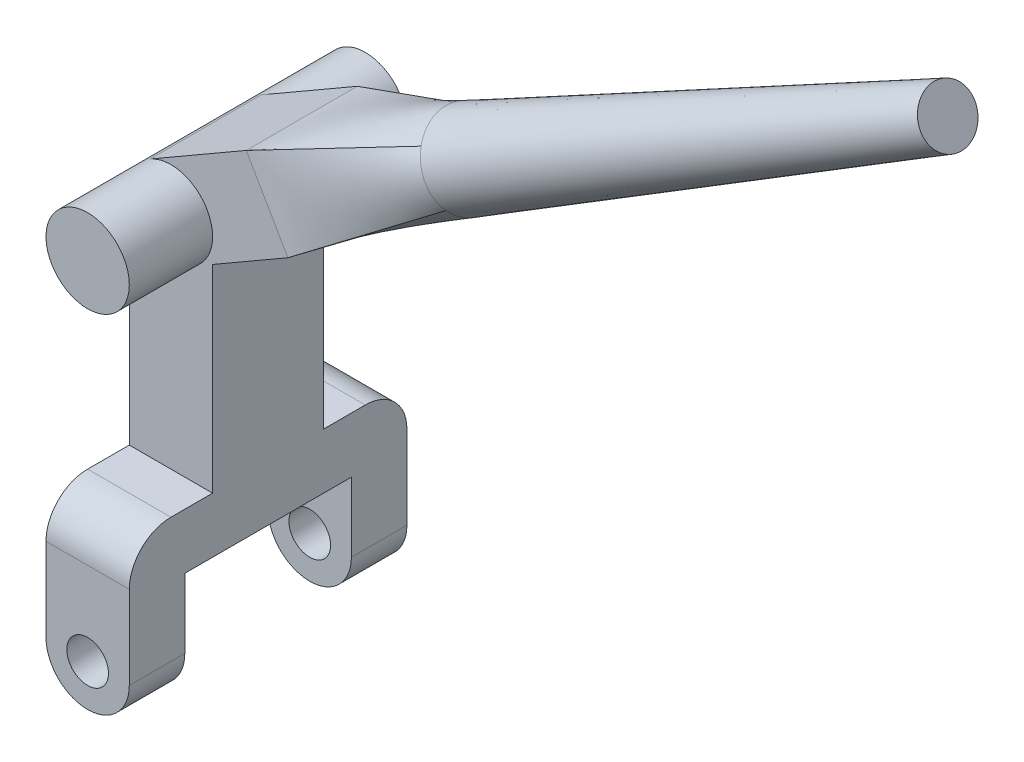
ISO-10303-21;
HEADER;
FILE_DESCRIPTION(('STEP AP214'),'2;1');
FILE_NAME('part.step','',(''),(''),'','','');
FILE_SCHEMA(('AUTOMOTIVE_DESIGN { 1 0 10303 214 1 1 1 1 }'));
ENDSEC;
DATA;
#1=APPLICATION_CONTEXT('core data for automotive mechanical design processes');
#2=APPLICATION_PROTOCOL_DEFINITION('international standard','automotive_design',2000,#1);
#3=PRODUCT_CONTEXT('',#1,'mechanical');
#4=PRODUCT('Part','Part','',(#3));
#5=PRODUCT_RELATED_PRODUCT_CATEGORY('part','',(#4));
#6=PRODUCT_DEFINITION_FORMATION('','',#4);
#7=PRODUCT_DEFINITION_CONTEXT('part definition',#1,'design');
#8=PRODUCT_DEFINITION('design','',#6,#7);
#9=PRODUCT_DEFINITION_SHAPE('','',#8);
#10=(LENGTH_UNIT() NAMED_UNIT(*) SI_UNIT(.MILLI.,.METRE.));
#11=(NAMED_UNIT(*) PLANE_ANGLE_UNIT() SI_UNIT($,.RADIAN.));
#12=(NAMED_UNIT(*) SI_UNIT($,.STERADIAN.) SOLID_ANGLE_UNIT());
#13=UNCERTAINTY_MEASURE_WITH_UNIT(LENGTH_MEASURE(1.E-05),#10,'distance_accuracy_value','');
#14=(GEOMETRIC_REPRESENTATION_CONTEXT(3) GLOBAL_UNCERTAINTY_ASSIGNED_CONTEXT((#13)) GLOBAL_UNIT_ASSIGNED_CONTEXT((#10,
#11,#12)) REPRESENTATION_CONTEXT('',''));
#15=CARTESIAN_POINT('',(0.,0.,0.));
#16=DIRECTION('',(0.,0.,1.));
#17=DIRECTION('',(1.,0.,0.));
#18=AXIS2_PLACEMENT_3D('',#15,#16,#17);
#19=CARTESIAN_POINT('',(0.,-63.5,0.));
#20=DIRECTION('',(0.,-1.,0.));
#21=DIRECTION('',(0.,0.,-1.));
#22=AXIS2_PLACEMENT_3D('',#19,#20,#21);
#23=PLANE('',#22);
#24=DIRECTION('',(0.,0.,-1.));
#25=VECTOR('',#24,1.);
#26=CARTESIAN_POINT('',(-9.525,-63.5,63.5));
#27=LINE('',#26,#25);
#28=CARTESIAN_POINT('',(-9.525,-63.5,50.8));
#29=VERTEX_POINT('',#28);
#30=CARTESIAN_POINT('',(-9.525,-63.5,12.7));
#31=VERTEX_POINT('',#30);
#32=EDGE_CURVE('E287',#29,#31,#27,.T.);
#33=ORIENTED_EDGE('',*,*,#32,.T.);
#34=DIRECTION('',(-1.,0.,0.));
#35=VECTOR('',#34,1.);
#36=CARTESIAN_POINT('',(9.525,-63.5,12.7));
#37=LINE('',#36,#35);
#38=CARTESIAN_POINT('',(9.525,-63.5,12.7));
#39=VERTEX_POINT('',#38);
#40=EDGE_CURVE('E284',#39,#31,#37,.T.);
#41=ORIENTED_EDGE('',*,*,#40,.F.);
#42=DIRECTION('',(0.,0.,1.));
#43=VECTOR('',#42,1.);
#44=CARTESIAN_POINT('',(9.525,-63.5,63.5));
#45=LINE('',#44,#43);
#46=CARTESIAN_POINT('',(9.525,-63.5,50.8));
#47=VERTEX_POINT('',#46);
#48=EDGE_CURVE('E268',#39,#47,#45,.T.);
#49=ORIENTED_EDGE('',*,*,#48,.T.);
#50=DIRECTION('',(1.,0.,0.));
#51=VECTOR('',#50,1.);
#52=CARTESIAN_POINT('',(-9.525,-63.5,50.8));
#53=LINE('',#52,#51);
#54=EDGE_CURVE('E276',#29,#47,#53,.T.);
#55=ORIENTED_EDGE('',*,*,#54,.F.);
#56=EDGE_LOOP('',(#33,#41,#49,#55));
#57=FACE_BOUND('',#56,.T.);
#58=ADVANCED_FACE('F78',(#57),#23,.T.);
#59=CARTESIAN_POINT('',(0.,0.,63.5));
#60=DIRECTION('',(0.,0.,-1.));
#61=DIRECTION('',(-1.,0.,0.));
#62=AXIS2_PLACEMENT_3D('',#59,#60,#61);
#63=CYLINDRICAL_SURFACE('',#62,9.525);
#64=CARTESIAN_POINT('',(0.,0.,0.));
#65=DIRECTION('',(0.,0.,1.));
#66=DIRECTION('',(1.,0.,0.));
#67=AXIS2_PLACEMENT_3D('',#64,#65,#66);
#68=CIRCLE('',#67,9.525);
#69=CARTESIAN_POINT('',(9.525,0.,0.));
#70=VERTEX_POINT('',#69);
#71=EDGE_CURVE('E703',#70,#70,#68,.T.);
#72=ORIENTED_EDGE('',*,*,#71,.T.);
#73=EDGE_LOOP('',(#72));
#74=FACE_BOUND('',#73,.T.);
#75=CARTESIAN_POINT('',(0.,0.,63.5));
#76=DIRECTION('',(0.,0.,1.));
#77=DIRECTION('',(1.,0.,0.));
#78=AXIS2_PLACEMENT_3D('',#75,#76,#77);
#79=CIRCLE('',#78,9.525);
#80=CARTESIAN_POINT('',(9.525,0.,63.5));
#81=VERTEX_POINT('',#80);
#82=EDGE_CURVE('E699',#81,#81,#79,.T.);
#83=ORIENTED_EDGE('',*,*,#82,.F.);
#84=EDGE_LOOP('',(#83));
#85=FACE_BOUND('',#84,.T.);
#86=CARTESIAN_POINT('',(0.,0.,44.45));
#87=DIRECTION('',(0.,0.,1.));
#88=DIRECTION('',(1.,0.,0.));
#89=AXIS2_PLACEMENT_3D('',#86,#87,#88);
#90=CIRCLE('',#89,9.525);
#91=CARTESIAN_POINT('',(-9.525,0.,44.45));
#92=VERTEX_POINT('',#91);
#93=CARTESIAN_POINT('',(-4.76249999999998,8.24889197104679,44.45));
#94=VERTEX_POINT('',#93);
#95=EDGE_CURVE('E683',#92,#94,#90,.T.);
#96=ORIENTED_EDGE('',*,*,#95,.T.);
#97=DIRECTION('',(0.,0.,1.));
#98=VECTOR('',#97,1.);
#99=CARTESIAN_POINT('',(-4.76249999999998,8.24889197104679,44.45));
#100=LINE('',#99,#98);
#101=CARTESIAN_POINT('',(-4.76249999999998,8.24889197104679,19.05));
#102=VERTEX_POINT('',#101);
#103=EDGE_CURVE('E476',#102,#94,#100,.T.);
#104=ORIENTED_EDGE('',*,*,#103,.F.);
#105=CARTESIAN_POINT('',(0.,0.,19.05));
#106=DIRECTION('',(0.,0.,-1.));
#107=DIRECTION('',(-1.,0.,0.));
#108=AXIS2_PLACEMENT_3D('',#105,#106,#107);
#109=CIRCLE('',#108,9.525);
#110=CARTESIAN_POINT('',(-9.52500000000001,0.,19.05));
#111=VERTEX_POINT('',#110);
#112=EDGE_CURVE('E489',#102,#111,#109,.T.);
#113=ORIENTED_EDGE('',*,*,#112,.T.);
#114=DIRECTION('',(0.,0.,1.));
#115=VECTOR('',#114,1.);
#116=CARTESIAN_POINT('',(-9.52500000000001,0.,19.05));
#117=LINE('',#116,#115);
#118=EDGE_CURVE('E677',#111,#92,#117,.T.);
#119=ORIENTED_EDGE('',*,*,#118,.T.);
#120=EDGE_LOOP('',(#96,#104,#113,#119));
#121=FACE_BOUND('',#120,.T.);
#122=ADVANCED_FACE('F620',(#74,#85,#121),#63,.T.);
#123=CARTESIAN_POINT('',(9.52499999999999,-50.8,19.05));
#124=DIRECTION('',(1.,0.,0.));
#125=DIRECTION('',(0.,0.,-1.));
#126=AXIS2_PLACEMENT_3D('',#123,#124,#125);
#127=PLANE('',#126);
#128=DIRECTION('',(0.,0.,1.));
#129=VECTOR('',#128,1.);
#130=CARTESIAN_POINT('',(9.525,-50.8,63.5));
#131=LINE('',#130,#129);
#132=CARTESIAN_POINT('',(9.525,-50.8,44.45));
#133=VERTEX_POINT('',#132);
#134=CARTESIAN_POINT('',(9.525,-50.8,53.975));
#135=VERTEX_POINT('',#134);
#136=EDGE_CURVE('E310',#133,#135,#131,.T.);
#137=ORIENTED_EDGE('',*,*,#136,.T.);
#138=CARTESIAN_POINT('',(9.525,-60.325,53.975));
#139=DIRECTION('',(1.,0.,0.));
#140=DIRECTION('',(0.,0.,-1.));
#141=AXIS2_PLACEMENT_3D('',#138,#139,#140);
#142=CIRCLE('',#141,9.525);
#143=CARTESIAN_POINT('',(9.525,-60.325,63.5));
#144=VERTEX_POINT('',#143);
#145=EDGE_CURVE('E551',#135,#144,#142,.T.);
#146=ORIENTED_EDGE('',*,*,#145,.T.);
#147=DIRECTION('',(0.,1.,0.));
#148=VECTOR('',#147,1.);
#149=CARTESIAN_POINT('',(9.525,-63.5,63.5));
#150=LINE('',#149,#148);
#151=CARTESIAN_POINT('',(9.525,-79.375,63.5));
#152=VERTEX_POINT('',#151);
#153=EDGE_CURVE('E316',#152,#144,#150,.T.);
#154=ORIENTED_EDGE('',*,*,#153,.F.);
#155=DIRECTION('',(0.,0.,1.));
#156=VECTOR('',#155,1.);
#157=CARTESIAN_POINT('',(9.52499999999999,-79.375,19.05));
#158=LINE('',#157,#156);
#159=CARTESIAN_POINT('',(9.525,-79.375,50.8));
#160=VERTEX_POINT('',#159);
#161=EDGE_CURVE('E271',#152,#160,#158,.F.);
#162=ORIENTED_EDGE('',*,*,#161,.T.);
#163=DIRECTION('',(0.,1.,0.));
#164=VECTOR('',#163,1.);
#165=CARTESIAN_POINT('',(9.525,-88.9,50.8));
#166=LINE('',#165,#164);
#167=EDGE_CURVE('E263',#160,#47,#166,.T.);
#168=ORIENTED_EDGE('',*,*,#167,.T.);
#169=ORIENTED_EDGE('',*,*,#48,.F.);
#170=DIRECTION('',(0.,1.,0.));
#171=VECTOR('',#170,1.);
#172=CARTESIAN_POINT('',(9.525,-88.9,12.7));
#173=LINE('',#172,#171);
#174=CARTESIAN_POINT('',(9.525,-79.375,12.7));
#175=VERTEX_POINT('',#174);
#176=EDGE_CURVE('E292',#175,#39,#173,.T.);
#177=ORIENTED_EDGE('',*,*,#176,.F.);
#178=DIRECTION('',(0.,0.,1.));
#179=VECTOR('',#178,1.);
#180=CARTESIAN_POINT('',(9.52499999999999,-79.375,19.05));
#181=LINE('',#180,#179);
#182=CARTESIAN_POINT('',(9.525,-79.375,0.));
#183=VERTEX_POINT('',#182);
#184=EDGE_CURVE('E494',#175,#183,#181,.F.);
#185=ORIENTED_EDGE('',*,*,#184,.T.);
#186=DIRECTION('',(0.,1.,0.));
#187=VECTOR('',#186,1.);
#188=CARTESIAN_POINT('',(9.525,-63.5,0.));
#189=LINE('',#188,#187);
#190=CARTESIAN_POINT('',(9.525,-60.325,0.));
#191=VERTEX_POINT('',#190);
#192=EDGE_CURVE('E320',#183,#191,#189,.T.);
#193=ORIENTED_EDGE('',*,*,#192,.T.);
#194=CARTESIAN_POINT('',(9.52499999999999,-60.325,9.525));
#195=DIRECTION('',(1.,0.,0.));
#196=DIRECTION('',(0.,0.,-1.));
#197=AXIS2_PLACEMENT_3D('',#194,#195,#196);
#198=CIRCLE('',#197,9.525);
#199=CARTESIAN_POINT('',(9.525,-50.8,9.525));
#200=VERTEX_POINT('',#199);
#201=EDGE_CURVE('E97',#191,#200,#198,.T.);
#202=ORIENTED_EDGE('',*,*,#201,.T.);
#203=CARTESIAN_POINT('',(9.525,-50.8,19.05));
#204=VERTEX_POINT('',#203);
#205=EDGE_CURVE('E305',#200,#204,#131,.T.);
#206=ORIENTED_EDGE('',*,*,#205,.T.);
#207=DIRECTION('',(0.,1.,0.));
#208=VECTOR('',#207,1.);
#209=CARTESIAN_POINT('',(9.52499999999999,-50.8,19.05));
#210=LINE('',#209,#208);
#211=CARTESIAN_POINT('',(9.52499999999999,-5.4992613140312,19.05));
#212=VERTEX_POINT('',#211);
#213=EDGE_CURVE('E693',#204,#212,#210,.T.);
#214=ORIENTED_EDGE('',*,*,#213,.T.);
#215=DIRECTION('',(0.,0.,1.));
#216=VECTOR('',#215,1.);
#217=CARTESIAN_POINT('',(9.52499999999999,-5.4992613140312,19.05));
#218=LINE('',#217,#216);
#219=CARTESIAN_POINT('',(9.52500000000001,-5.49926131403119,44.45));
#220=VERTEX_POINT('',#219);
#221=EDGE_CURVE('E728',#212,#220,#218,.T.);
#222=ORIENTED_EDGE('',*,*,#221,.T.);
#223=DIRECTION('',(0.,1.,0.));
#224=VECTOR('',#223,1.);
#225=CARTESIAN_POINT('',(9.525,-50.8,44.45));
#226=LINE('',#225,#224);
#227=EDGE_CURVE('E687',#133,#220,#226,.T.);
#228=ORIENTED_EDGE('',*,*,#227,.F.);
#229=EDGE_LOOP('',(#137,#146,#154,#162,#168,#169,#177,#185,#193,#202,#206,#214,#222,#228));
#230=FACE_BOUND('',#229,.T.);
#231=ADVANCED_FACE('F266',(#230),#127,.T.);
#232=CARTESIAN_POINT('',(0.,0.,63.5));
#233=DIRECTION('',(0.,0.,1.));
#234=DIRECTION('',(1.,0.,0.));
#235=AXIS2_PLACEMENT_3D('',#232,#233,#234);
#236=PLANE('',#235);
#237=ORIENTED_EDGE('',*,*,#82,.T.);
#238=EDGE_LOOP('',(#237));
#239=FACE_BOUND('',#238,.T.);
#240=ADVANCED_FACE('F899',(#239),#236,.T.);
#241=CARTESIAN_POINT('',(0.,0.,0.));
#242=DIRECTION('',(0.,0.,1.));
#243=DIRECTION('',(1.,0.,0.));
#244=AXIS2_PLACEMENT_3D('',#241,#242,#243);
#245=PLANE('',#244);
#246=ORIENTED_EDGE('',*,*,#71,.F.);
#247=EDGE_LOOP('',(#246));
#248=FACE_BOUND('',#247,.T.);
#249=ADVANCED_FACE('F908',(#248),#245,.F.);
#250=CARTESIAN_POINT('',(-9.52500000000001,-50.8,19.05));
#251=DIRECTION('',(-1.,0.,0.));
#252=DIRECTION('',(0.,0.,1.));
#253=AXIS2_PLACEMENT_3D('',#250,#251,#252);
#254=PLANE('',#253);
#255=DIRECTION('',(0.,1.,0.));
#256=VECTOR('',#255,1.);
#257=CARTESIAN_POINT('',(-9.525,-63.5,63.5));
#258=LINE('',#257,#256);
#259=CARTESIAN_POINT('',(-9.525,-79.375,63.5));
#260=VERTEX_POINT('',#259);
#261=CARTESIAN_POINT('',(-9.525,-60.325,63.5));
#262=VERTEX_POINT('',#261);
#263=EDGE_CURVE('E286',#260,#262,#258,.T.);
#264=ORIENTED_EDGE('',*,*,#263,.T.);
#265=CARTESIAN_POINT('',(-9.525,-60.325,53.975));
#266=DIRECTION('',(-1.,0.,0.));
#267=DIRECTION('',(0.,0.,1.));
#268=AXIS2_PLACEMENT_3D('',#265,#266,#267);
#269=CIRCLE('',#268,9.525);
#270=CARTESIAN_POINT('',(-9.525,-50.8,53.975));
#271=VERTEX_POINT('',#270);
#272=EDGE_CURVE('E543',#262,#271,#269,.T.);
#273=ORIENTED_EDGE('',*,*,#272,.T.);
#274=DIRECTION('',(0.,0.,-1.));
#275=VECTOR('',#274,1.);
#276=CARTESIAN_POINT('',(-9.525,-50.8,63.5));
#277=LINE('',#276,#275);
#278=CARTESIAN_POINT('',(-9.525,-50.8,44.45));
#279=VERTEX_POINT('',#278);
#280=EDGE_CURVE('E307',#271,#279,#277,.T.);
#281=ORIENTED_EDGE('',*,*,#280,.T.);
#282=DIRECTION('',(0.,1.,0.));
#283=VECTOR('',#282,1.);
#284=CARTESIAN_POINT('',(-9.525,-50.8,44.45));
#285=LINE('',#284,#283);
#286=EDGE_CURVE('E680',#279,#92,#285,.T.);
#287=ORIENTED_EDGE('',*,*,#286,.T.);
#288=ORIENTED_EDGE('',*,*,#118,.F.);
#289=DIRECTION('',(0.,1.,0.));
#290=VECTOR('',#289,1.);
#291=CARTESIAN_POINT('',(-9.52500000000001,-50.8,19.05));
#292=LINE('',#291,#290);
#293=CARTESIAN_POINT('',(-9.525,-50.8,19.05));
#294=VERTEX_POINT('',#293);
#295=EDGE_CURVE('E707',#294,#111,#292,.T.);
#296=ORIENTED_EDGE('',*,*,#295,.F.);
#297=CARTESIAN_POINT('',(-9.525,-50.8,9.525));
#298=VERTEX_POINT('',#297);
#299=EDGE_CURVE('E303',#294,#298,#277,.T.);
#300=ORIENTED_EDGE('',*,*,#299,.T.);
#301=CARTESIAN_POINT('',(-9.52500000000001,-60.325,9.525));
#302=DIRECTION('',(-1.,0.,0.));
#303=DIRECTION('',(0.,0.,1.));
#304=AXIS2_PLACEMENT_3D('',#301,#302,#303);
#305=CIRCLE('',#304,9.525);
#306=CARTESIAN_POINT('',(-9.525,-60.325,0.));
#307=VERTEX_POINT('',#306);
#308=EDGE_CURVE('E540',#298,#307,#305,.T.);
#309=ORIENTED_EDGE('',*,*,#308,.T.);
#310=DIRECTION('',(0.,1.,0.));
#311=VECTOR('',#310,1.);
#312=CARTESIAN_POINT('',(-9.525,-63.5,0.));
#313=LINE('',#312,#311);
#314=CARTESIAN_POINT('',(-9.525,-79.375,0.));
#315=VERTEX_POINT('',#314);
#316=EDGE_CURVE('E323',#315,#307,#313,.T.);
#317=ORIENTED_EDGE('',*,*,#316,.F.);
#318=DIRECTION('',(0.,0.,-1.));
#319=VECTOR('',#318,1.);
#320=CARTESIAN_POINT('',(-9.52500000000001,-79.375,19.05));
#321=LINE('',#320,#319);
#322=CARTESIAN_POINT('',(-9.525,-79.375,12.7));
#323=VERTEX_POINT('',#322);
#324=EDGE_CURVE('E516',#315,#323,#321,.F.);
#325=ORIENTED_EDGE('',*,*,#324,.T.);
#326=DIRECTION('',(0.,1.,0.));
#327=VECTOR('',#326,1.);
#328=CARTESIAN_POINT('',(-9.525,-88.9,12.7));
#329=LINE('',#328,#327);
#330=EDGE_CURVE('E297',#323,#31,#329,.T.);
#331=ORIENTED_EDGE('',*,*,#330,.T.);
#332=ORIENTED_EDGE('',*,*,#32,.F.);
#333=DIRECTION('',(0.,1.,0.));
#334=VECTOR('',#333,1.);
#335=CARTESIAN_POINT('',(-9.525,-88.9,50.8));
#336=LINE('',#335,#334);
#337=CARTESIAN_POINT('',(-9.525,-79.375,50.8));
#338=VERTEX_POINT('',#337);
#339=EDGE_CURVE('E275',#338,#29,#336,.T.);
#340=ORIENTED_EDGE('',*,*,#339,.F.);
#341=DIRECTION('',(0.,0.,-1.));
#342=VECTOR('',#341,1.);
#343=CARTESIAN_POINT('',(-9.52500000000001,-79.375,19.05));
#344=LINE('',#343,#342);
#345=EDGE_CURVE('E519',#338,#260,#344,.F.);
#346=ORIENTED_EDGE('',*,*,#345,.T.);
#347=EDGE_LOOP('',(#264,#273,#281,#287,#288,#296,#300,#309,#317,#325,#331,#332,#340,#346));
#348=FACE_BOUND('',#347,.T.);
#349=ADVANCED_FACE('F573',(#348),#254,.T.);
#350=CARTESIAN_POINT('',(-9.52500000000001,-50.8,19.05));
#351=DIRECTION('',(0.,0.,-1.));
#352=DIRECTION('',(-1.,0.,0.));
#353=AXIS2_PLACEMENT_3D('',#350,#351,#352);
#354=PLANE('',#353);
#355=DIRECTION('',(-0.86602540378444,-0.499999999999998,0.));
#356=VECTOR('',#355,1.);
#357=CARTESIAN_POINT('',(26.7595452561248,4.45110802895316,19.05));
#358=LINE('',#357,#356);
#359=CARTESIAN_POINT('',(26.7595452561247,4.45110802895316,19.05));
#360=VERTEX_POINT('',#359);
#361=EDGE_CURVE('E720',#360,#212,#358,.T.);
#362=ORIENTED_EDGE('',*,*,#361,.T.);
#363=ORIENTED_EDGE('',*,*,#213,.F.);
#364=DIRECTION('',(-1.,0.,0.));
#365=VECTOR('',#364,1.);
#366=CARTESIAN_POINT('',(-9.52500000000001,-50.8,19.05));
#367=LINE('',#366,#365);
#368=EDGE_CURVE('E676',#204,#294,#367,.T.);
#369=ORIENTED_EDGE('',*,*,#368,.T.);
#370=ORIENTED_EDGE('',*,*,#295,.T.);
#371=ORIENTED_EDGE('',*,*,#112,.F.);
#372=DIRECTION('',(-0.86602540378444,-0.499999999999998,0.));
#373=VECTOR('',#372,1.);
#374=CARTESIAN_POINT('',(17.2345452561248,20.9488919710467,19.05));
#375=LINE('',#374,#373);
#376=CARTESIAN_POINT('',(17.2345452561248,20.9488919710467,19.05));
#377=VERTEX_POINT('',#376);
#378=EDGE_CURVE('E715',#377,#102,#375,.T.);
#379=ORIENTED_EDGE('',*,*,#378,.F.);
#380=DIRECTION('',(0.499999999999998,-0.86602540378444,0.));
#381=VECTOR('',#380,1.);
#382=CARTESIAN_POINT('',(17.2345452561248,20.9488919710467,19.05));
#383=LINE('',#382,#381);
#384=EDGE_CURVE('E732',#360,#377,#383,.F.);
#385=ORIENTED_EDGE('',*,*,#384,.F.);
#386=EDGE_LOOP('',(#362,#363,#369,#370,#371,#379,#385));
#387=FACE_BOUND('',#386,.T.);
#388=ADVANCED_FACE('F762',(#387),#354,.T.);
#389=CARTESIAN_POINT('',(-9.525,-50.8,44.45));
#390=DIRECTION('',(0.,0.,1.));
#391=DIRECTION('',(1.,0.,0.));
#392=AXIS2_PLACEMENT_3D('',#389,#390,#391);
#393=PLANE('',#392);
#394=DIRECTION('',(-0.86602540378444,-0.499999999999998,0.));
#395=VECTOR('',#394,1.);
#396=CARTESIAN_POINT('',(17.2345452561248,20.9488919710467,44.45));
#397=LINE('',#396,#395);
#398=CARTESIAN_POINT('',(17.2345452561247,20.9488919710467,44.45));
#399=VERTEX_POINT('',#398);
#400=EDGE_CURVE('E712',#399,#94,#397,.T.);
#401=ORIENTED_EDGE('',*,*,#400,.T.);
#402=ORIENTED_EDGE('',*,*,#95,.F.);
#403=ORIENTED_EDGE('',*,*,#286,.F.);
#404=DIRECTION('',(1.,0.,0.));
#405=VECTOR('',#404,1.);
#406=CARTESIAN_POINT('',(-9.525,-50.8,44.45));
#407=LINE('',#406,#405);
#408=EDGE_CURVE('E671',#279,#133,#407,.T.);
#409=ORIENTED_EDGE('',*,*,#408,.T.);
#410=ORIENTED_EDGE('',*,*,#227,.T.);
#411=DIRECTION('',(-0.86602540378444,-0.499999999999998,0.));
#412=VECTOR('',#411,1.);
#413=CARTESIAN_POINT('',(26.7595452561248,4.45110802895316,44.45));
#414=LINE('',#413,#412);
#415=CARTESIAN_POINT('',(26.7595452561247,4.45110802895312,44.45));
#416=VERTEX_POINT('',#415);
#417=EDGE_CURVE('E724',#416,#220,#414,.T.);
#418=ORIENTED_EDGE('',*,*,#417,.F.);
#419=DIRECTION('',(-0.499999999999998,0.86602540378444,0.));
#420=VECTOR('',#419,1.);
#421=CARTESIAN_POINT('',(26.7595452561247,4.45110802895317,44.45));
#422=LINE('',#421,#420);
#423=EDGE_CURVE('E469',#399,#416,#422,.F.);
#424=ORIENTED_EDGE('',*,*,#423,.F.);
#425=EDGE_LOOP('',(#401,#402,#403,#409,#410,#418,#424));
#426=FACE_BOUND('',#425,.T.);
#427=ADVANCED_FACE('F682',(#426),#393,.T.);
#428=CARTESIAN_POINT('',(26.7595452561248,4.45110802895316,44.45));
#429=DIRECTION('',(-0.499999999999998,0.86602540378444,0.));
#430=DIRECTION('',(-0.86602540378444,-0.499999999999998,0.));
#431=AXIS2_PLACEMENT_3D('',#428,#429,#430);
#432=PLANE('',#431);
#433=ORIENTED_EDGE('',*,*,#221,.F.);
#434=ORIENTED_EDGE('',*,*,#361,.F.);
#435=DIRECTION('',(0.,0.,1.));
#436=VECTOR('',#435,1.);
#437=CARTESIAN_POINT('',(26.7595452561248,4.45110802895316,44.45));
#438=LINE('',#437,#436);
#439=EDGE_CURVE('E735',#416,#360,#438,.F.);
#440=ORIENTED_EDGE('',*,*,#439,.F.);
#441=ORIENTED_EDGE('',*,*,#417,.T.);
#442=EDGE_LOOP('',(#433,#434,#440,#441));
#443=FACE_BOUND('',#442,.T.);
#444=ADVANCED_FACE('F758',(#443),#432,.F.);
#445=CARTESIAN_POINT('',(17.2345452561248,20.9488919710467,44.45));
#446=DIRECTION('',(0.499999999999998,-0.86602540378444,0.));
#447=DIRECTION('',(0.86602540378444,0.499999999999998,0.));
#448=AXIS2_PLACEMENT_3D('',#445,#446,#447);
#449=PLANE('',#448);
#450=ORIENTED_EDGE('',*,*,#103,.T.);
#451=ORIENTED_EDGE('',*,*,#400,.F.);
#452=DIRECTION('',(0.,0.,1.));
#453=VECTOR('',#452,1.);
#454=CARTESIAN_POINT('',(17.2345452561248,20.9488919710467,44.45));
#455=LINE('',#454,#453);
#456=EDGE_CURVE('E716',#377,#399,#455,.T.);
#457=ORIENTED_EDGE('',*,*,#456,.F.);
#458=ORIENTED_EDGE('',*,*,#378,.T.);
#459=EDGE_LOOP('',(#450,#451,#457,#458));
#460=FACE_BOUND('',#459,.T.);
#461=ADVANCED_FACE('F366',(#460),#449,.F.);
#462=CARTESIAN_POINT('',(17.2345452561248,20.9488919710467,44.45));
#463=CARTESIAN_POINT('',(52.135113140312,36.699335182628,39.37));
#464=CARTESIAN_POINT('',(18.0282952561248,19.5740766425389,44.45));
#465=CARTESIAN_POINT('',(52.5161131403119,36.0394238249442,39.9415));
#466=CARTESIAN_POINT('',(18.8220452561248,18.1992613140311,44.45));
#467=CARTESIAN_POINT('',(52.9609842140884,35.2688845223457,40.4261687363039));
#468=CARTESIAN_POINT('',(20.4095452561248,15.4496306570155,44.45));
#469=CARTESIAN_POINT('',(53.9350528773463,33.5817481075223,41.0941015339664));
#470=CARTESIAN_POINT('',(21.2032952561248,14.0748153285078,44.45));
#471=CARTESIAN_POINT('',(54.4634464736453,32.6665435523384,41.275));
#472=CARTESIAN_POINT('',(22.7907952561248,11.3251846714922,44.45));
#473=CARTESIAN_POINT('',(55.5217798069786,30.8334564476614,41.275));
#474=CARTESIAN_POINT('',(23.5845452561248,9.95036934298435,44.45));
#475=CARTESIAN_POINT('',(56.0501734032776,29.9182518924775,41.0941015339664));
#476=CARTESIAN_POINT('',(25.1720452561248,7.20073868596876,44.45));
#477=CARTESIAN_POINT('',(57.0242420665355,28.2311154776542,40.4261687363039));
#478=CARTESIAN_POINT('',(25.9657952561248,5.82592335746096,44.45));
#479=CARTESIAN_POINT('',(57.4691131403119,27.4605761750556,39.9415));
#480=CARTESIAN_POINT('',(26.7595452561248,4.45110802895316,44.45));
#481=CARTESIAN_POINT('',(57.8501131403119,26.8006648173718,39.37));
#482=B_SPLINE_SURFACE_WITH_KNOTS('',3,1,((#462,#463),(#464,#465),(#466,#467),(#468,#469),(#470,
#471),(#472,#473),(#474,#475),(#476,#477),(#478,#479),(#480,#481)),.UNSPECIFIED.,.F.,.F.,.F.,(4,
2,2,2,4),(2,2),(0.,0.25,0.5,0.75,1.),(0.,1.),.UNSPECIFIED.);
#483=DIRECTION('',(0.804922499985643,0.578621181533795,-0.131519189844286));
#484=VECTOR('',#483,1.);
#485=CARTESIAN_POINT('',(42.3048291982183,15.6258864231625,41.91));
#486=LINE('',#485,#484);
#487=CARTESIAN_POINT('',(57.8503453384031,26.8002626384806,39.3706167239583));
#488=VERTEX_POINT('',#487);
#489=EDGE_CURVE('E441',#416,#488,#486,.T.);
#490=CARTESIAN_POINT('',(54.9926131403119,31.7499999999999,31.75));
#491=DIRECTION('',(0.86602540378444,0.499999999999998,0.));
#492=DIRECTION('',(-0.499999999999998,0.86602540378444,0.));
#493=AXIS2_PLACEMENT_3D('',#490,#491,#492);
#494=CIRCLE('',#493,9.525);
#495=CARTESIAN_POINT('',(52.134886781379,36.6997272478006,39.3706010590914));
#496=VERTEX_POINT('',#495);
#497=EDGE_CURVE('E337',#496,#488,#494,.T.);
#498=DIRECTION('',(-0.903561892368857,-0.407772742298345,0.131519189844286));
#499=VECTOR('',#498,1.);
#500=CARTESIAN_POINT('',(34.6848291982184,28.8241135768374,41.91));
#501=LINE('',#500,#499);
#502=EDGE_CURVE('E331',#496,#399,#501,.T.);
#503=ORIENTED_EDGE('',*,*,#423,.T.);
#504=ORIENTED_EDGE('',*,*,#489,.T.);
#505=ORIENTED_EDGE('',*,*,#497,.F.);
#506=ORIENTED_EDGE('',*,*,#502,.T.);
#507=EDGE_LOOP('',(#503,#504,#505,#506));
#508=FACE_BOUND('',#507,.T.);
#509=ADVANCED_FACE('F359',(#508),#482,.T.);
#510=CARTESIAN_POINT('',(26.7595452561248,4.45110802895316,44.45));
#511=CARTESIAN_POINT('',(57.8501131403119,26.8006648173718,39.37));
#512=CARTESIAN_POINT('',(26.7595452561248,4.45110802895316,43.3916666666667));
#513=CARTESIAN_POINT('',(58.1041131403119,26.3607239122493,38.989));
#514=CARTESIAN_POINT('',(26.7595452561248,4.45110802895316,42.3333333333333));
#515=CARTESIAN_POINT('',(58.3520121832843,25.9313501746734,38.5373146931882));
#516=CARTESIAN_POINT('',(26.7595452561248,4.45110802895316,40.2166666666666));
#517=CARTESIAN_POINT('',(58.8095839603532,25.1388126086805,37.488712704072));
#518=CARTESIAN_POINT('',(26.7595452561248,4.45110802895316,39.1583333333333));
#519=CARTESIAN_POINT('',(59.0190404759521,24.776023281687,36.8915224913495));
#520=CARTESIAN_POINT('',(26.7595452561248,4.45110802895316,37.0416666666666));
#521=CARTESIAN_POINT('',(59.3705975693777,24.1671085341126,35.5731833910035));
#522=CARTESIAN_POINT('',(26.7595452561248,4.45110802895316,35.9833333333333));
#523=CARTESIAN_POINT('',(59.5123853296611,23.9215249294104,34.8521065088757));
#524=CARTESIAN_POINT('',(26.7595452561248,4.45110802895316,33.8666666666666));
#525=CARTESIAN_POINT('',(59.7047640278859,23.588315249791,33.337124260355));
#526=CARTESIAN_POINT('',(26.7595452561248,4.45110802895316,32.8083333333333));
#527=CARTESIAN_POINT('',(59.7551131403119,23.5011080289531,32.54375));
#528=CARTESIAN_POINT('',(26.7595452561248,4.45110802895316,30.6916666666666));
#529=CARTESIAN_POINT('',(59.7551131403119,23.5011080289531,30.95625));
#530=CARTESIAN_POINT('',(26.7595452561248,4.45110802895316,29.6333333333333));
#531=CARTESIAN_POINT('',(59.7047640278859,23.588315249791,30.162875739645));
#532=CARTESIAN_POINT('',(26.7595452561248,4.45110802895316,27.5166666666667));
#533=CARTESIAN_POINT('',(59.512385329661,23.9215249294104,28.6478934911243));
#534=CARTESIAN_POINT('',(26.7595452561248,4.45110802895316,26.4583333333333));
#535=CARTESIAN_POINT('',(59.3705975693777,24.1671085341126,27.9268166089965));
#536=CARTESIAN_POINT('',(26.7595452561248,4.45110802895316,24.3416666666667));
#537=CARTESIAN_POINT('',(59.0190404759521,24.776023281687,26.6084775086505));
#538=CARTESIAN_POINT('',(26.7595452561248,4.45110802895316,23.2833333333333));
#539=CARTESIAN_POINT('',(58.8095839603532,25.1388126086806,26.011287295928));
#540=CARTESIAN_POINT('',(26.7595452561248,4.45110802895316,21.1666666666667));
#541=CARTESIAN_POINT('',(58.3520121832843,25.9313501746734,24.9626853068118));
#542=CARTESIAN_POINT('',(26.7595452561248,4.45110802895316,20.1083333333333));
#543=CARTESIAN_POINT('',(58.1041131403119,26.3607239122493,24.511));
#544=CARTESIAN_POINT('',(26.7595452561248,4.45110802895316,19.05));
#545=CARTESIAN_POINT('',(57.8501131403119,26.8006648173718,24.13));
#546=B_SPLINE_SURFACE_WITH_KNOTS('',3,1,((#510,#511),(#512,#513),(#514,#515),(#516,#517),(#518,
#519),(#520,#521),(#522,#523),(#524,#525),(#526,#527),(#528,#529),(#530,#531),(#532,#533),(#534,
#535),(#536,#537),(#538,#539),(#540,#541),(#542,#543),(#544,#545)),.UNSPECIFIED.,.F.,.F.,.F.,(4,
2,2,2,2,2,2,2,4),(2,2),(0.,0.125,0.249999999999999,0.374999999999999,0.5,0.624999999999999,
0.749999999999999,0.875,1.),(0.,1.),.UNSPECIFIED.);
#547=DIRECTION('',(0.804922499985643,0.578621181533795,0.131519189844286));
#548=VECTOR('',#547,1.);
#549=CARTESIAN_POINT('',(42.3048291982183,15.6258864231625,21.59));
#550=LINE('',#549,#548);
#551=CARTESIAN_POINT('',(57.8503394993629,26.8002727519948,24.1293989405952));
#552=VERTEX_POINT('',#551);
#553=EDGE_CURVE('E445',#360,#552,#550,.T.);
#554=EDGE_CURVE('E460',#488,#552,#494,.T.);
#555=ORIENTED_EDGE('',*,*,#439,.T.);
#556=ORIENTED_EDGE('',*,*,#553,.T.);
#557=ORIENTED_EDGE('',*,*,#554,.F.);
#558=ORIENTED_EDGE('',*,*,#489,.F.);
#559=EDGE_LOOP('',(#555,#556,#557,#558));
#560=FACE_BOUND('',#559,.T.);
#561=ADVANCED_FACE('F365',(#560),#546,.T.);
#562=CARTESIAN_POINT('',(17.2345452561248,20.9488919710467,19.05));
#563=CARTESIAN_POINT('',(52.135113140312,36.699335182628,24.13));
#564=CARTESIAN_POINT('',(17.2345452561248,20.9488919710467,20.1083333333333));
#565=CARTESIAN_POINT('',(51.881113140312,37.1392760877505,24.511));
#566=CARTESIAN_POINT('',(17.2345452561248,20.9488919710467,21.1666666666667));
#567=CARTESIAN_POINT('',(51.6332140973395,37.5686498253264,24.9626853068118));
#568=CARTESIAN_POINT('',(17.2345452561248,20.9488919710467,23.2833333333334));
#569=CARTESIAN_POINT('',(51.1756423202707,38.3611873913193,26.0112872959279));
#570=CARTESIAN_POINT('',(17.2345452561248,20.9488919710467,24.3416666666667));
#571=CARTESIAN_POINT('',(50.9661858046718,38.7239767183128,26.6084775086505));
#572=CARTESIAN_POINT('',(17.2345452561248,20.9488919710467,26.4583333333334));
#573=CARTESIAN_POINT('',(50.6146287112462,39.3328914658872,27.9268166089965));
#574=CARTESIAN_POINT('',(17.2345452561248,20.9488919710467,27.5166666666667));
#575=CARTESIAN_POINT('',(50.4728409509628,39.5784750705894,28.6478934911243));
#576=CARTESIAN_POINT('',(17.2345452561248,20.9488919710467,29.6333333333334));
#577=CARTESIAN_POINT('',(50.280462252738,39.9116847502088,30.162875739645));
#578=CARTESIAN_POINT('',(17.2345452561248,20.9488919710467,30.6916666666667));
#579=CARTESIAN_POINT('',(50.230113140312,39.9988919710467,30.95625));
#580=CARTESIAN_POINT('',(17.2345452561248,20.9488919710467,32.8083333333334));
#581=CARTESIAN_POINT('',(50.230113140312,39.9988919710467,32.54375));
#582=CARTESIAN_POINT('',(17.2345452561248,20.9488919710467,33.8666666666667));
#583=CARTESIAN_POINT('',(50.280462252738,39.9116847502088,33.337124260355));
#584=CARTESIAN_POINT('',(17.2345452561248,20.9488919710467,35.9833333333334));
#585=CARTESIAN_POINT('',(50.4728409509628,39.5784750705894,34.8521065088757));
#586=CARTESIAN_POINT('',(17.2345452561248,20.9488919710467,37.0416666666667));
#587=CARTESIAN_POINT('',(50.6146287112462,39.3328914658872,35.5731833910035));
#588=CARTESIAN_POINT('',(17.2345452561248,20.9488919710467,39.1583333333334));
#589=CARTESIAN_POINT('',(50.9661858046718,38.7239767183128,36.8915224913495));
#590=CARTESIAN_POINT('',(17.2345452561248,20.9488919710467,40.2166666666667));
#591=CARTESIAN_POINT('',(51.1756423202707,38.3611873913193,37.4887127040721));
#592=CARTESIAN_POINT('',(17.2345452561248,20.9488919710467,42.3333333333333));
#593=CARTESIAN_POINT('',(51.6332140973395,37.5686498253264,38.5373146931882));
#594=CARTESIAN_POINT('',(17.2345452561248,20.9488919710467,43.3916666666667));
#595=CARTESIAN_POINT('',(51.8811131403119,37.1392760877505,38.989));
#596=CARTESIAN_POINT('',(17.2345452561248,20.9488919710467,44.45));
#597=CARTESIAN_POINT('',(52.135113140312,36.699335182628,39.37));
#598=B_SPLINE_SURFACE_WITH_KNOTS('',3,1,((#562,#563),(#564,#565),(#566,#567),(#568,#569),(#570,
#571),(#572,#573),(#574,#575),(#576,#577),(#578,#579),(#580,#581),(#582,#583),(#584,#585),(#586,
#587),(#588,#589),(#590,#591),(#592,#593),(#594,#595),(#596,#597)),.UNSPECIFIED.,.F.,.F.,.F.,(4,
2,2,2,2,2,2,2,4),(2,2),(0.,0.125,0.250000000000001,0.375000000000001,0.5,0.625000000000001,
0.750000000000001,0.875,1.),(0.,1.),.UNSPECIFIED.);
#599=CARTESIAN_POINT('',(52.1348809423278,36.6997373613339,24.1293832763259));
#600=VERTEX_POINT('',#599);
#601=EDGE_CURVE('E392',#600,#496,#494,.T.);
#602=DIRECTION('',(0.903561892368857,0.407772742298345,0.131519189844286));
#603=VECTOR('',#602,1.);
#604=CARTESIAN_POINT('',(34.6848291982184,28.8241135768374,21.59));
#605=LINE('',#604,#603);
#606=EDGE_CURVE('E453',#377,#600,#605,.T.);
#607=ORIENTED_EDGE('',*,*,#456,.T.);
#608=ORIENTED_EDGE('',*,*,#502,.F.);
#609=ORIENTED_EDGE('',*,*,#601,.F.);
#610=ORIENTED_EDGE('',*,*,#606,.F.);
#611=EDGE_LOOP('',(#607,#608,#609,#610));
#612=FACE_BOUND('',#611,.T.);
#613=ADVANCED_FACE('F398',(#612),#598,.T.);
#614=CARTESIAN_POINT('',(26.7595452561248,4.45110802895316,19.05));
#615=CARTESIAN_POINT('',(57.8501131403119,26.8006648173718,24.13));
#616=CARTESIAN_POINT('',(25.9657952561248,5.82592335746095,19.05));
#617=CARTESIAN_POINT('',(57.4691131403119,27.4605761750556,23.5585));
#618=CARTESIAN_POINT('',(25.1720452561248,7.20073868596875,19.05));
#619=CARTESIAN_POINT('',(57.0242420665355,28.2311154776541,23.0738312636961));
#620=CARTESIAN_POINT('',(23.5845452561248,9.95036934298434,19.05));
#621=CARTESIAN_POINT('',(56.0501734032776,29.9182518924775,22.4058984660336));
#622=CARTESIAN_POINT('',(22.7907952561248,11.3251846714921,19.05));
#623=CARTESIAN_POINT('',(55.5217798069786,30.8334564476614,22.225));
#624=CARTESIAN_POINT('',(21.2032952561248,14.0748153285077,19.05));
#625=CARTESIAN_POINT('',(54.4634464736453,32.6665435523384,22.225));
#626=CARTESIAN_POINT('',(20.4095452561248,15.4496306570155,19.05));
#627=CARTESIAN_POINT('',(53.9350528773463,33.5817481075223,22.4058984660336));
#628=CARTESIAN_POINT('',(18.8220452561248,18.1992613140311,19.05));
#629=CARTESIAN_POINT('',(52.9609842140884,35.2688845223456,23.0738312636961));
#630=CARTESIAN_POINT('',(18.0282952561248,19.5740766425389,19.05));
#631=CARTESIAN_POINT('',(52.516113140312,36.0394238249442,23.5585));
#632=CARTESIAN_POINT('',(17.2345452561248,20.9488919710467,19.05));
#633=CARTESIAN_POINT('',(52.135113140312,36.699335182628,24.13));
#634=B_SPLINE_SURFACE_WITH_KNOTS('',3,1,((#614,#615),(#616,#617),(#618,#619),(#620,#621),(#622,
#623),(#624,#625),(#626,#627),(#628,#629),(#630,#631),(#632,#633)),.UNSPECIFIED.,.F.,.F.,.F.,(4,
2,2,2,4),(2,2),(0.,0.25,0.5,0.75,1.),(0.,1.),.UNSPECIFIED.);
#635=EDGE_CURVE('E437',#552,#600,#494,.T.);
#636=ORIENTED_EDGE('',*,*,#384,.T.);
#637=ORIENTED_EDGE('',*,*,#606,.T.);
#638=ORIENTED_EDGE('',*,*,#635,.F.);
#639=ORIENTED_EDGE('',*,*,#553,.F.);
#640=EDGE_LOOP('',(#636,#637,#638,#639));
#641=FACE_BOUND('',#640,.T.);
#642=ADVANCED_FACE('F356',(#641),#634,.T.);
#643=CARTESIAN_POINT('',(54.9926131403119,31.7499999999999,31.75));
#644=DIRECTION('',(-0.86602540378444,-0.499999999999998,0.));
#645=DIRECTION('',(-0.499999999999998,0.86602540378444,0.));
#646=AXIS2_PLACEMENT_3D('',#643,#644,#645);
#647=CONICAL_SURFACE('',#646,9.525,0.026179938779915);
#648=CARTESIAN_POINT('',(164.977839420936,95.2499999999997,31.75));
#649=DIRECTION('',(0.86602540378444,0.499999999999998,0.));
#650=DIRECTION('',(-0.499999999999998,0.86602540378444,0.));
#651=AXIS2_PLACEMENT_3D('',#648,#649,#650);
#652=CIRCLE('',#651,6.19938796071326);
#653=CARTESIAN_POINT('',(161.878145440579,100.618827461893,31.75));
#654=VERTEX_POINT('',#653);
#655=EDGE_CURVE('E327',#654,#654,#652,.T.);
#656=ORIENTED_EDGE('',*,*,#655,.F.);
#657=EDGE_LOOP('',(#656));
#658=FACE_BOUND('',#657,.T.);
#659=ORIENTED_EDGE('',*,*,#497,.T.);
#660=ORIENTED_EDGE('',*,*,#554,.T.);
#661=ORIENTED_EDGE('',*,*,#635,.T.);
#662=ORIENTED_EDGE('',*,*,#601,.T.);
#663=EDGE_LOOP('',(#659,#660,#661,#662));
#664=FACE_BOUND('',#663,.T.);
#665=ADVANCED_FACE('F345',(#658,#664),#647,.T.);
#666=CARTESIAN_POINT('',(164.977839420936,95.2499999999997,31.75));
#667=DIRECTION('',(0.86602540378444,0.499999999999998,0.));
#668=DIRECTION('',(-0.499999999999998,0.86602540378444,0.));
#669=AXIS2_PLACEMENT_3D('',#666,#667,#668);
#670=PLANE('',#669);
#671=ORIENTED_EDGE('',*,*,#655,.T.);
#672=EDGE_LOOP('',(#671));
#673=FACE_BOUND('',#672,.T.);
#674=ADVANCED_FACE('F355',(#673),#670,.T.);
#675=CARTESIAN_POINT('',(0.,-50.8,0.));
#676=DIRECTION('',(0.,-1.,0.));
#677=DIRECTION('',(0.,0.,-1.));
#678=AXIS2_PLACEMENT_3D('',#675,#676,#677);
#679=PLANE('',#678);
#680=ORIENTED_EDGE('',*,*,#205,.F.);
#681=DIRECTION('',(1.,0.,0.));
#682=VECTOR('',#681,1.);
#683=CARTESIAN_POINT('',(0.,-50.8,9.525));
#684=LINE('',#683,#682);
#685=EDGE_CURVE('E12',#200,#298,#684,.F.);
#686=ORIENTED_EDGE('',*,*,#685,.T.);
#687=ORIENTED_EDGE('',*,*,#299,.F.);
#688=ORIENTED_EDGE('',*,*,#368,.F.);
#689=EDGE_LOOP('',(#680,#686,#687,#688));
#690=FACE_BOUND('',#689,.T.);
#691=ADVANCED_FACE('F617',(#690),#679,.F.);
#692=CARTESIAN_POINT('',(-9.525,-63.5,0.));
#693=DIRECTION('',(0.,0.,1.));
#694=DIRECTION('',(1.,0.,0.));
#695=AXIS2_PLACEMENT_3D('',#692,#693,#694);
#696=PLANE('',#695);
#697=CARTESIAN_POINT('',(0.,-79.375,0.));
#698=DIRECTION('',(0.,0.,-1.));
#699=DIRECTION('',(-1.,0.,0.));
#700=AXIS2_PLACEMENT_3D('',#697,#698,#699);
#701=CIRCLE('',#700,4.7625);
#702=CARTESIAN_POINT('',(-4.7625,-79.375,0.));
#703=VERTEX_POINT('',#702);
#704=EDGE_CURVE('E585',#703,#703,#701,.T.);
#705=ORIENTED_EDGE('',*,*,#704,.F.);
#706=EDGE_LOOP('',(#705));
#707=FACE_BOUND('',#706,.T.);
#708=ORIENTED_EDGE('',*,*,#316,.T.);
#709=DIRECTION('',(1.,0.,0.));
#710=VECTOR('',#709,1.);
#711=CARTESIAN_POINT('',(-9.525,-60.325,0.));
#712=LINE('',#711,#710);
#713=EDGE_CURVE('E87',#307,#191,#712,.T.);
#714=ORIENTED_EDGE('',*,*,#713,.T.);
#715=ORIENTED_EDGE('',*,*,#192,.F.);
#716=CARTESIAN_POINT('',(0.,-79.375,0.));
#717=DIRECTION('',(0.,0.,1.));
#718=DIRECTION('',(1.,0.,0.));
#719=AXIS2_PLACEMENT_3D('',#716,#717,#718);
#720=CIRCLE('',#719,9.525);
#721=CARTESIAN_POINT('',(0.,-88.9,0.));
#722=VERTEX_POINT('',#721);
#723=EDGE_CURVE('E501',#183,#722,#720,.F.);
#724=ORIENTED_EDGE('',*,*,#723,.T.);
#725=CARTESIAN_POINT('',(0.,-79.375,0.));
#726=DIRECTION('',(0.,0.,1.));
#727=DIRECTION('',(1.,0.,0.));
#728=AXIS2_PLACEMENT_3D('',#725,#726,#727);
#729=CIRCLE('',#728,9.525);
#730=EDGE_CURVE('E498',#722,#315,#729,.F.);
#731=ORIENTED_EDGE('',*,*,#730,.T.);
#732=EDGE_LOOP('',(#708,#714,#715,#724,#731));
#733=FACE_BOUND('',#732,.T.);
#734=ADVANCED_FACE('F558',(#707,#733),#696,.F.);
#735=CARTESIAN_POINT('',(-9.525,-63.5,63.5));
#736=DIRECTION('',(0.,0.,-1.));
#737=DIRECTION('',(-1.,0.,0.));
#738=AXIS2_PLACEMENT_3D('',#735,#736,#737);
#739=PLANE('',#738);
#740=CARTESIAN_POINT('',(0.,-79.375,63.5));
#741=DIRECTION('',(0.,0.,-1.));
#742=DIRECTION('',(-1.,0.,0.));
#743=AXIS2_PLACEMENT_3D('',#740,#741,#742);
#744=CIRCLE('',#743,4.7625);
#745=CARTESIAN_POINT('',(-4.7625,-79.375,63.5));
#746=VERTEX_POINT('',#745);
#747=EDGE_CURVE('E536',#746,#746,#744,.T.);
#748=ORIENTED_EDGE('',*,*,#747,.T.);
#749=EDGE_LOOP('',(#748));
#750=FACE_BOUND('',#749,.T.);
#751=ORIENTED_EDGE('',*,*,#153,.T.);
#752=DIRECTION('',(-1.,0.,0.));
#753=VECTOR('',#752,1.);
#754=CARTESIAN_POINT('',(-9.525,-60.325,63.5));
#755=LINE('',#754,#753);
#756=EDGE_CURVE('E522',#144,#262,#755,.T.);
#757=ORIENTED_EDGE('',*,*,#756,.T.);
#758=ORIENTED_EDGE('',*,*,#263,.F.);
#759=CARTESIAN_POINT('',(0.,-79.375,63.5));
#760=DIRECTION('',(0.,0.,-1.));
#761=DIRECTION('',(-1.,0.,0.));
#762=AXIS2_PLACEMENT_3D('',#759,#760,#761);
#763=CIRCLE('',#762,9.525);
#764=CARTESIAN_POINT('',(0.,-88.9,63.5));
#765=VERTEX_POINT('',#764);
#766=EDGE_CURVE('E504',#260,#765,#763,.F.);
#767=ORIENTED_EDGE('',*,*,#766,.T.);
#768=CARTESIAN_POINT('',(0.,-79.375,63.5));
#769=DIRECTION('',(0.,0.,-1.));
#770=DIRECTION('',(-1.,0.,0.));
#771=AXIS2_PLACEMENT_3D('',#768,#769,#770);
#772=CIRCLE('',#771,9.525);
#773=EDGE_CURVE('E507',#765,#152,#772,.F.);
#774=ORIENTED_EDGE('',*,*,#773,.T.);
#775=EDGE_LOOP('',(#751,#757,#758,#767,#774));
#776=FACE_BOUND('',#775,.T.);
#777=ADVANCED_FACE('F595',(#750,#776),#739,.F.);
#778=ORIENTED_EDGE('',*,*,#280,.F.);
#779=DIRECTION('',(-1.,0.,0.));
#780=VECTOR('',#779,1.);
#781=CARTESIAN_POINT('',(0.,-50.8,53.975));
#782=LINE('',#781,#780);
#783=EDGE_CURVE('E546',#271,#135,#782,.F.);
#784=ORIENTED_EDGE('',*,*,#783,.T.);
#785=ORIENTED_EDGE('',*,*,#136,.F.);
#786=ORIENTED_EDGE('',*,*,#408,.F.);
#787=EDGE_LOOP('',(#778,#784,#785,#786));
#788=FACE_BOUND('',#787,.T.);
#789=ADVANCED_FACE('F607',(#788),#679,.F.);
#790=CARTESIAN_POINT('',(-9.525,-88.9,50.8));
#791=DIRECTION('',(0.,0.,1.));
#792=DIRECTION('',(1.,0.,0.));
#793=AXIS2_PLACEMENT_3D('',#790,#791,#792);
#794=PLANE('',#793);
#795=CARTESIAN_POINT('',(0.,-79.375,50.8));
#796=DIRECTION('',(0.,0.,1.));
#797=DIRECTION('',(1.,0.,0.));
#798=AXIS2_PLACEMENT_3D('',#795,#796,#797);
#799=CIRCLE('',#798,4.7625);
#800=CARTESIAN_POINT('',(4.7625,-79.375,50.8));
#801=VERTEX_POINT('',#800);
#802=EDGE_CURVE('E531',#801,#801,#799,.T.);
#803=ORIENTED_EDGE('',*,*,#802,.T.);
#804=EDGE_LOOP('',(#803));
#805=FACE_BOUND('',#804,.T.);
#806=ORIENTED_EDGE('',*,*,#167,.F.);
#807=CARTESIAN_POINT('',(0.,-79.375,50.8));
#808=DIRECTION('',(0.,0.,1.));
#809=DIRECTION('',(1.,0.,0.));
#810=AXIS2_PLACEMENT_3D('',#807,#808,#809);
#811=CIRCLE('',#810,9.525);
#812=CARTESIAN_POINT('',(0.,-88.9,50.8));
#813=VERTEX_POINT('',#812);
#814=EDGE_CURVE('E513',#160,#813,#811,.F.);
#815=ORIENTED_EDGE('',*,*,#814,.T.);
#816=CARTESIAN_POINT('',(0.,-79.375,50.8));
#817=DIRECTION('',(0.,0.,1.));
#818=DIRECTION('',(1.,0.,0.));
#819=AXIS2_PLACEMENT_3D('',#816,#817,#818);
#820=CIRCLE('',#819,9.525);
#821=EDGE_CURVE('E510',#813,#338,#820,.F.);
#822=ORIENTED_EDGE('',*,*,#821,.T.);
#823=ORIENTED_EDGE('',*,*,#339,.T.);
#824=ORIENTED_EDGE('',*,*,#54,.T.);
#825=EDGE_LOOP('',(#806,#815,#822,#823,#824));
#826=FACE_BOUND('',#825,.T.);
#827=ADVANCED_FACE('F289',(#805,#826),#794,.F.);
#828=CARTESIAN_POINT('',(9.525,-88.9,12.7));
#829=DIRECTION('',(0.,0.,-1.));
#830=DIRECTION('',(-1.,0.,0.));
#831=AXIS2_PLACEMENT_3D('',#828,#829,#830);
#832=PLANE('',#831);
#833=CARTESIAN_POINT('',(0.,-79.375,12.7));
#834=DIRECTION('',(0.,0.,-1.));
#835=DIRECTION('',(-1.,0.,0.));
#836=AXIS2_PLACEMENT_3D('',#833,#834,#835);
#837=CIRCLE('',#836,4.7625);
#838=CARTESIAN_POINT('',(-4.7625,-79.375,12.7));
#839=VERTEX_POINT('',#838);
#840=EDGE_CURVE('E532',#839,#839,#837,.T.);
#841=ORIENTED_EDGE('',*,*,#840,.T.);
#842=EDGE_LOOP('',(#841));
#843=FACE_BOUND('',#842,.T.);
#844=CARTESIAN_POINT('',(0.,-79.375,12.7));
#845=DIRECTION('',(0.,0.,-1.));
#846=DIRECTION('',(-1.,0.,0.));
#847=AXIS2_PLACEMENT_3D('',#844,#845,#846);
#848=CIRCLE('',#847,9.525);
#849=CARTESIAN_POINT('',(0.,-88.9,12.7));
#850=VERTEX_POINT('',#849);
#851=EDGE_CURVE('E485',#323,#850,#848,.F.);
#852=ORIENTED_EDGE('',*,*,#851,.T.);
#853=CARTESIAN_POINT('',(0.,-79.375,12.7));
#854=DIRECTION('',(0.,0.,-1.));
#855=DIRECTION('',(-1.,0.,0.));
#856=AXIS2_PLACEMENT_3D('',#853,#854,#855);
#857=CIRCLE('',#856,9.525);
#858=EDGE_CURVE('E488',#850,#175,#857,.F.);
#859=ORIENTED_EDGE('',*,*,#858,.T.);
#860=ORIENTED_EDGE('',*,*,#176,.T.);
#861=ORIENTED_EDGE('',*,*,#40,.T.);
#862=ORIENTED_EDGE('',*,*,#330,.F.);
#863=EDGE_LOOP('',(#852,#859,#860,#861,#862));
#864=FACE_BOUND('',#863,.T.);
#865=ADVANCED_FACE('F575',(#843,#864),#832,.F.);
#866=CARTESIAN_POINT('',(0.,-79.375,0.));
#867=DIRECTION('',(0.,0.,-1.));
#868=DIRECTION('',(-1.,0.,0.));
#869=AXIS2_PLACEMENT_3D('',#866,#867,#868);
#870=CYLINDRICAL_SURFACE('',#869,9.525);
#871=ORIENTED_EDGE('',*,*,#324,.F.);
#872=ORIENTED_EDGE('',*,*,#730,.F.);
#873=DIRECTION('',(0.,0.,-1.));
#874=VECTOR('',#873,1.);
#875=CARTESIAN_POINT('',(0.,-88.9,0.));
#876=LINE('',#875,#874);
#877=EDGE_CURVE('E523',#850,#722,#876,.T.);
#878=ORIENTED_EDGE('',*,*,#877,.F.);
#879=ORIENTED_EDGE('',*,*,#851,.F.);
#880=EDGE_LOOP('',(#871,#872,#878,#879));
#881=FACE_BOUND('',#880,.T.);
#882=ADVANCED_FACE('F569',(#881),#870,.T.);
#883=CARTESIAN_POINT('',(0.,-79.375,0.));
#884=DIRECTION('',(0.,0.,1.));
#885=DIRECTION('',(1.,0.,0.));
#886=AXIS2_PLACEMENT_3D('',#883,#884,#885);
#887=CYLINDRICAL_SURFACE('',#886,9.525);
#888=ORIENTED_EDGE('',*,*,#723,.F.);
#889=ORIENTED_EDGE('',*,*,#184,.F.);
#890=ORIENTED_EDGE('',*,*,#858,.F.);
#891=ORIENTED_EDGE('',*,*,#877,.T.);
#892=EDGE_LOOP('',(#888,#889,#890,#891));
#893=FACE_BOUND('',#892,.T.);
#894=ADVANCED_FACE('F564',(#893),#887,.T.);
#895=CARTESIAN_POINT('',(0.,-79.375,0.));
#896=DIRECTION('',(0.,0.,-1.));
#897=DIRECTION('',(-1.,0.,0.));
#898=AXIS2_PLACEMENT_3D('',#895,#896,#897);
#899=CYLINDRICAL_SURFACE('',#898,9.525);
#900=ORIENTED_EDGE('',*,*,#345,.F.);
#901=ORIENTED_EDGE('',*,*,#821,.F.);
#902=DIRECTION('',(0.,0.,-1.));
#903=VECTOR('',#902,1.);
#904=CARTESIAN_POINT('',(0.,-88.9,0.));
#905=LINE('',#904,#903);
#906=EDGE_CURVE('E527',#765,#813,#905,.T.);
#907=ORIENTED_EDGE('',*,*,#906,.F.);
#908=ORIENTED_EDGE('',*,*,#766,.F.);
#909=EDGE_LOOP('',(#900,#901,#907,#908));
#910=FACE_BOUND('',#909,.T.);
#911=ADVANCED_FACE('F643',(#910),#899,.T.);
#912=CARTESIAN_POINT('',(0.,-79.375,0.));
#913=DIRECTION('',(0.,0.,1.));
#914=DIRECTION('',(1.,0.,0.));
#915=AXIS2_PLACEMENT_3D('',#912,#913,#914);
#916=CYLINDRICAL_SURFACE('',#915,9.525);
#917=ORIENTED_EDGE('',*,*,#814,.F.);
#918=ORIENTED_EDGE('',*,*,#161,.F.);
#919=ORIENTED_EDGE('',*,*,#773,.F.);
#920=ORIENTED_EDGE('',*,*,#906,.T.);
#921=EDGE_LOOP('',(#917,#918,#919,#920));
#922=FACE_BOUND('',#921,.T.);
#923=ADVANCED_FACE('F638',(#922),#916,.T.);
#924=CARTESIAN_POINT('',(0.,-79.375,63.5));
#925=DIRECTION('',(0.,0.,-1.));
#926=DIRECTION('',(-1.,0.,0.));
#927=AXIS2_PLACEMENT_3D('',#924,#925,#926);
#928=CYLINDRICAL_SURFACE('',#927,4.7625);
#929=ORIENTED_EDGE('',*,*,#704,.T.);
#930=EDGE_LOOP('',(#929));
#931=FACE_BOUND('',#930,.T.);
#932=ORIENTED_EDGE('',*,*,#840,.F.);
#933=EDGE_LOOP('',(#932));
#934=FACE_BOUND('',#933,.T.);
#935=ADVANCED_FACE('F602',(#931,#934),#928,.F.);
#936=ORIENTED_EDGE('',*,*,#747,.F.);
#937=EDGE_LOOP('',(#936));
#938=FACE_BOUND('',#937,.T.);
#939=ORIENTED_EDGE('',*,*,#802,.F.);
#940=EDGE_LOOP('',(#939));
#941=FACE_BOUND('',#940,.T.);
#942=ADVANCED_FACE('F598',(#938,#941),#928,.F.);
#943=CARTESIAN_POINT('',(-9.525,-60.325,53.975));
#944=DIRECTION('',(-1.,0.,0.));
#945=DIRECTION('',(0.,0.,1.));
#946=AXIS2_PLACEMENT_3D('',#943,#944,#945);
#947=CYLINDRICAL_SURFACE('',#946,9.525);
#948=ORIENTED_EDGE('',*,*,#145,.F.);
#949=ORIENTED_EDGE('',*,*,#783,.F.);
#950=ORIENTED_EDGE('',*,*,#272,.F.);
#951=ORIENTED_EDGE('',*,*,#756,.F.);
#952=EDGE_LOOP('',(#948,#949,#950,#951));
#953=FACE_BOUND('',#952,.T.);
#954=ADVANCED_FACE('F601',(#953),#947,.T.);
#955=CARTESIAN_POINT('',(-9.525,-60.325,9.525));
#956=DIRECTION('',(1.,0.,0.));
#957=DIRECTION('',(0.,0.,-1.));
#958=AXIS2_PLACEMENT_3D('',#955,#956,#957);
#959=CYLINDRICAL_SURFACE('',#958,9.525);
#960=ORIENTED_EDGE('',*,*,#308,.F.);
#961=ORIENTED_EDGE('',*,*,#685,.F.);
#962=ORIENTED_EDGE('',*,*,#201,.F.);
#963=ORIENTED_EDGE('',*,*,#713,.F.);
#964=EDGE_LOOP('',(#960,#961,#962,#963));
#965=FACE_BOUND('',#964,.T.);
#966=ADVANCED_FACE('F80',(#965),#959,.T.);
#967=CLOSED_SHELL('',(#58,#122,#231,#240,#249,#349,#388,#427,#444,#461,#509,#561,#613,#642,#665,
#674,#691,#734,#777,#789,#827,#865,#882,#894,#911,#923,#935,#942,#954,#966));
#968=MANIFOLD_SOLID_BREP('B2',#967);
#969=ADVANCED_BREP_SHAPE_REPRESENTATION('',(#18,#968),#14);
#970=SHAPE_DEFINITION_REPRESENTATION(#9,#969);
ENDSEC;
END-ISO-10303-21;
